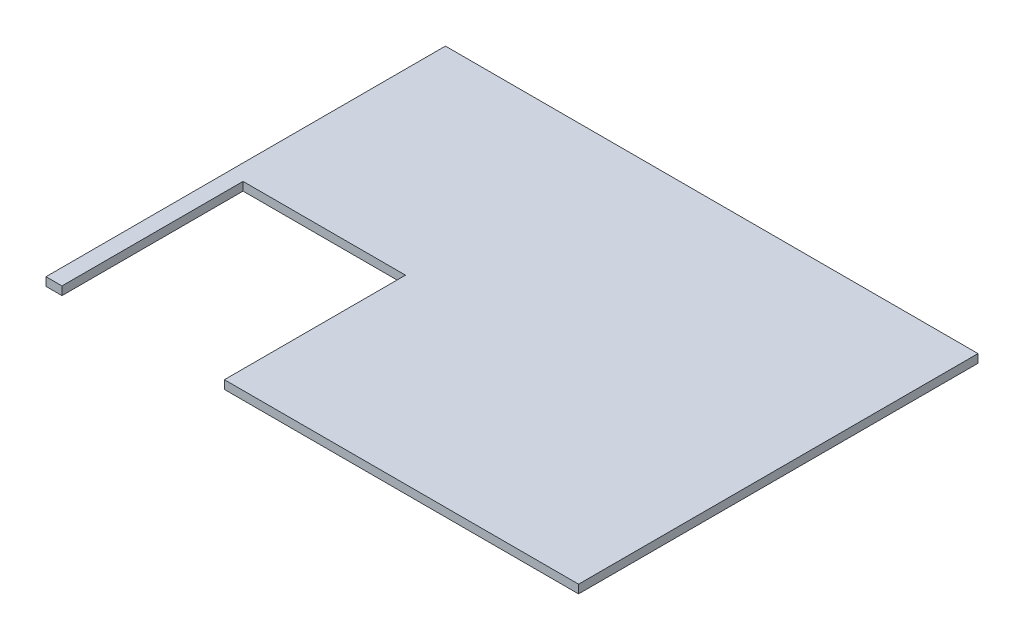
ISO-10303-21;
HEADER;
FILE_DESCRIPTION(('STEP AP214'),'2;1');
FILE_NAME('part.step','',(''),(''),'','','');
FILE_SCHEMA(('AUTOMOTIVE_DESIGN { 1 0 10303 214 1 1 1 1 }'));
ENDSEC;
DATA;
#1=APPLICATION_CONTEXT('core data for automotive mechanical design processes');
#2=APPLICATION_PROTOCOL_DEFINITION('international standard','automotive_design',2000,#1);
#3=PRODUCT_CONTEXT('',#1,'mechanical');
#4=PRODUCT('Part','Part','',(#3));
#5=PRODUCT_RELATED_PRODUCT_CATEGORY('part','',(#4));
#6=PRODUCT_DEFINITION_FORMATION('','',#4);
#7=PRODUCT_DEFINITION_CONTEXT('part definition',#1,'design');
#8=PRODUCT_DEFINITION('design','',#6,#7);
#9=PRODUCT_DEFINITION_SHAPE('','',#8);
#10=(LENGTH_UNIT() NAMED_UNIT(*) SI_UNIT(.MILLI.,.METRE.));
#11=(NAMED_UNIT(*) PLANE_ANGLE_UNIT() SI_UNIT($,.RADIAN.));
#12=(NAMED_UNIT(*) SI_UNIT($,.STERADIAN.) SOLID_ANGLE_UNIT());
#13=UNCERTAINTY_MEASURE_WITH_UNIT(LENGTH_MEASURE(1.E-05),#10,'distance_accuracy_value','');
#14=(GEOMETRIC_REPRESENTATION_CONTEXT(3) GLOBAL_UNCERTAINTY_ASSIGNED_CONTEXT((#13)) GLOBAL_UNIT_ASSIGNED_CONTEXT((#10,
#11,#12)) REPRESENTATION_CONTEXT('',''));
#15=CARTESIAN_POINT('',(0.,0.,0.));
#16=DIRECTION('',(0.,0.,1.));
#17=DIRECTION('',(1.,0.,0.));
#18=AXIS2_PLACEMENT_3D('',#15,#16,#17);
#19=CARTESIAN_POINT('',(3.,1.5875,0.));
#20=DIRECTION('',(-1.,0.,0.));
#21=DIRECTION('',(0.,0.,1.));
#22=AXIS2_PLACEMENT_3D('',#19,#20,#21);
#23=PLANE('',#22);
#24=DIRECTION('',(0.,0.,-1.));
#25=VECTOR('',#24,1.);
#26=CARTESIAN_POINT('',(3.,0.,0.));
#27=LINE('',#26,#25);
#28=CARTESIAN_POINT('',(3.,0.,0.));
#29=VERTEX_POINT('',#28);
#30=CARTESIAN_POINT('',(3.,0.,-34.));
#31=VERTEX_POINT('',#30);
#32=EDGE_CURVE('E128',#29,#31,#27,.T.);
#33=ORIENTED_EDGE('',*,*,#32,.T.);
#34=DIRECTION('',(0.,-1.,0.));
#35=VECTOR('',#34,1.);
#36=CARTESIAN_POINT('',(3.,1.5875,-34.));
#37=LINE('',#36,#35);
#38=CARTESIAN_POINT('',(3.,1.5875,-34.));
#39=VERTEX_POINT('',#38);
#40=EDGE_CURVE('E11',#39,#31,#37,.T.);
#41=ORIENTED_EDGE('',*,*,#40,.F.);
#42=DIRECTION('',(0.,0.,-1.));
#43=VECTOR('',#42,1.);
#44=CARTESIAN_POINT('',(3.,1.5875,0.));
#45=LINE('',#44,#43);
#46=CARTESIAN_POINT('',(3.,1.5875,0.));
#47=VERTEX_POINT('',#46);
#48=EDGE_CURVE('E142',#47,#39,#45,.T.);
#49=ORIENTED_EDGE('',*,*,#48,.F.);
#50=DIRECTION('',(0.,-1.,0.));
#51=VECTOR('',#50,1.);
#52=CARTESIAN_POINT('',(3.,1.5875,0.));
#53=LINE('',#52,#51);
#54=EDGE_CURVE('E124',#47,#29,#53,.T.);
#55=ORIENTED_EDGE('',*,*,#54,.T.);
#56=EDGE_LOOP('',(#33,#41,#49,#55));
#57=FACE_BOUND('',#56,.T.);
#58=ADVANCED_FACE('F32',(#57),#23,.F.);
#59=CARTESIAN_POINT('',(3.,1.5875,-34.));
#60=DIRECTION('',(0.,0.,-1.));
#61=DIRECTION('',(-1.,0.,0.));
#62=AXIS2_PLACEMENT_3D('',#59,#60,#61);
#63=PLANE('',#62);
#64=DIRECTION('',(1.,0.,0.));
#65=VECTOR('',#64,1.);
#66=CARTESIAN_POINT('',(3.,0.,-34.));
#67=LINE('',#66,#65);
#68=CARTESIAN_POINT('',(33.5,0.,-34.));
#69=VERTEX_POINT('',#68);
#70=EDGE_CURVE('E131',#31,#69,#67,.T.);
#71=ORIENTED_EDGE('',*,*,#70,.T.);
#72=DIRECTION('',(0.,-1.,0.));
#73=VECTOR('',#72,1.);
#74=CARTESIAN_POINT('',(33.5,1.5875,-34.));
#75=LINE('',#74,#73);
#76=CARTESIAN_POINT('',(33.5,1.5875,-34.));
#77=VERTEX_POINT('',#76);
#78=EDGE_CURVE('E40',#77,#69,#75,.T.);
#79=ORIENTED_EDGE('',*,*,#78,.F.);
#80=DIRECTION('',(1.,0.,0.));
#81=VECTOR('',#80,1.);
#82=CARTESIAN_POINT('',(3.,1.5875,-34.));
#83=LINE('',#82,#81);
#84=EDGE_CURVE('E91',#39,#77,#83,.T.);
#85=ORIENTED_EDGE('',*,*,#84,.F.);
#86=ORIENTED_EDGE('',*,*,#40,.T.);
#87=EDGE_LOOP('',(#71,#79,#85,#86));
#88=FACE_BOUND('',#87,.T.);
#89=ADVANCED_FACE('F177',(#88),#63,.F.);
#90=CARTESIAN_POINT('',(33.5,1.5875,-34.));
#91=DIRECTION('',(1.,0.,0.));
#92=DIRECTION('',(0.,0.,-1.));
#93=AXIS2_PLACEMENT_3D('',#90,#91,#92);
#94=PLANE('',#93);
#95=DIRECTION('',(0.,0.,1.));
#96=VECTOR('',#95,1.);
#97=CARTESIAN_POINT('',(33.5,0.,-34.));
#98=LINE('',#97,#96);
#99=CARTESIAN_POINT('',(33.5,0.,0.));
#100=VERTEX_POINT('',#99);
#101=EDGE_CURVE('E133',#69,#100,#98,.T.);
#102=ORIENTED_EDGE('',*,*,#101,.T.);
#103=DIRECTION('',(0.,-1.,0.));
#104=VECTOR('',#103,1.);
#105=CARTESIAN_POINT('',(33.5,1.5875,0.));
#106=LINE('',#105,#104);
#107=CARTESIAN_POINT('',(33.5,1.5875,0.));
#108=VERTEX_POINT('',#107);
#109=EDGE_CURVE('E149',#108,#100,#106,.T.);
#110=ORIENTED_EDGE('',*,*,#109,.F.);
#111=DIRECTION('',(0.,0.,1.));
#112=VECTOR('',#111,1.);
#113=CARTESIAN_POINT('',(33.5,1.5875,-34.));
#114=LINE('',#113,#112);
#115=EDGE_CURVE('E157',#77,#108,#114,.T.);
#116=ORIENTED_EDGE('',*,*,#115,.F.);
#117=ORIENTED_EDGE('',*,*,#78,.T.);
#118=EDGE_LOOP('',(#102,#110,#116,#117));
#119=FACE_BOUND('',#118,.T.);
#120=ADVANCED_FACE('F155',(#119),#94,.F.);
#121=CARTESIAN_POINT('',(33.5,1.5875,0.));
#122=DIRECTION('',(0.,0.,-1.));
#123=DIRECTION('',(-1.,0.,0.));
#124=AXIS2_PLACEMENT_3D('',#121,#122,#123);
#125=PLANE('',#124);
#126=DIRECTION('',(1.,0.,0.));
#127=VECTOR('',#126,1.);
#128=CARTESIAN_POINT('',(33.5,0.,0.));
#129=LINE('',#128,#127);
#130=CARTESIAN_POINT('',(100.,0.,0.));
#131=VERTEX_POINT('',#130);
#132=EDGE_CURVE('E135',#100,#131,#129,.T.);
#133=ORIENTED_EDGE('',*,*,#132,.T.);
#134=DIRECTION('',(0.,-1.,0.));
#135=VECTOR('',#134,1.);
#136=CARTESIAN_POINT('',(100.,1.5875,0.));
#137=LINE('',#136,#135);
#138=CARTESIAN_POINT('',(100.,1.5875,0.));
#139=VERTEX_POINT('',#138);
#140=EDGE_CURVE('E146',#139,#131,#137,.T.);
#141=ORIENTED_EDGE('',*,*,#140,.F.);
#142=DIRECTION('',(1.,0.,0.));
#143=VECTOR('',#142,1.);
#144=CARTESIAN_POINT('',(33.5,1.5875,0.));
#145=LINE('',#144,#143);
#146=EDGE_CURVE('E169',#108,#139,#145,.T.);
#147=ORIENTED_EDGE('',*,*,#146,.F.);
#148=ORIENTED_EDGE('',*,*,#109,.T.);
#149=EDGE_LOOP('',(#133,#141,#147,#148));
#150=FACE_BOUND('',#149,.T.);
#151=ADVANCED_FACE('F165',(#150),#125,.F.);
#152=CARTESIAN_POINT('',(100.,1.5875,0.));
#153=DIRECTION('',(-1.,0.,0.));
#154=DIRECTION('',(0.,0.,1.));
#155=AXIS2_PLACEMENT_3D('',#152,#153,#154);
#156=PLANE('',#155);
#157=DIRECTION('',(0.,0.,-1.));
#158=VECTOR('',#157,1.);
#159=CARTESIAN_POINT('',(100.,0.,0.));
#160=LINE('',#159,#158);
#161=CARTESIAN_POINT('',(100.,0.,-75.));
#162=VERTEX_POINT('',#161);
#163=EDGE_CURVE('E137',#131,#162,#160,.T.);
#164=ORIENTED_EDGE('',*,*,#163,.T.);
#165=DIRECTION('',(0.,-1.,0.));
#166=VECTOR('',#165,1.);
#167=CARTESIAN_POINT('',(100.,1.5875,-75.));
#168=LINE('',#167,#166);
#169=CARTESIAN_POINT('',(100.,1.5875,-75.));
#170=VERTEX_POINT('',#169);
#171=EDGE_CURVE('E119',#170,#162,#168,.T.);
#172=ORIENTED_EDGE('',*,*,#171,.F.);
#173=DIRECTION('',(0.,0.,-1.));
#174=VECTOR('',#173,1.);
#175=CARTESIAN_POINT('',(100.,1.5875,0.));
#176=LINE('',#175,#174);
#177=EDGE_CURVE('E110',#139,#170,#176,.T.);
#178=ORIENTED_EDGE('',*,*,#177,.F.);
#179=ORIENTED_EDGE('',*,*,#140,.T.);
#180=EDGE_LOOP('',(#164,#172,#178,#179));
#181=FACE_BOUND('',#180,.T.);
#182=ADVANCED_FACE('F168',(#181),#156,.F.);
#183=CARTESIAN_POINT('',(100.,1.5875,-75.));
#184=DIRECTION('',(0.,0.,1.));
#185=DIRECTION('',(1.,0.,0.));
#186=AXIS2_PLACEMENT_3D('',#183,#184,#185);
#187=PLANE('',#186);
#188=DIRECTION('',(-1.,0.,0.));
#189=VECTOR('',#188,1.);
#190=CARTESIAN_POINT('',(100.,0.,-75.));
#191=LINE('',#190,#189);
#192=CARTESIAN_POINT('',(0.,0.,-75.));
#193=VERTEX_POINT('',#192);
#194=EDGE_CURVE('E118',#162,#193,#191,.T.);
#195=ORIENTED_EDGE('',*,*,#194,.T.);
#196=DIRECTION('',(0.,-1.,0.));
#197=VECTOR('',#196,1.);
#198=CARTESIAN_POINT('',(0.,1.5875,-75.));
#199=LINE('',#198,#197);
#200=CARTESIAN_POINT('',(0.,1.5875,-75.));
#201=VERTEX_POINT('',#200);
#202=EDGE_CURVE('E115',#201,#193,#199,.T.);
#203=ORIENTED_EDGE('',*,*,#202,.F.);
#204=DIRECTION('',(-1.,0.,0.));
#205=VECTOR('',#204,1.);
#206=CARTESIAN_POINT('',(100.,1.5875,-75.));
#207=LINE('',#206,#205);
#208=EDGE_CURVE('E104',#170,#201,#207,.T.);
#209=ORIENTED_EDGE('',*,*,#208,.F.);
#210=ORIENTED_EDGE('',*,*,#171,.T.);
#211=EDGE_LOOP('',(#195,#203,#209,#210));
#212=FACE_BOUND('',#211,.T.);
#213=ADVANCED_FACE('F116',(#212),#187,.F.);
#214=CARTESIAN_POINT('',(0.,1.5875,-75.));
#215=DIRECTION('',(1.,0.,0.));
#216=DIRECTION('',(0.,0.,-1.));
#217=AXIS2_PLACEMENT_3D('',#214,#215,#216);
#218=PLANE('',#217);
#219=DIRECTION('',(0.,0.,1.));
#220=VECTOR('',#219,1.);
#221=CARTESIAN_POINT('',(0.,0.,-75.));
#222=LINE('',#221,#220);
#223=CARTESIAN_POINT('',(0.,0.,0.));
#224=VERTEX_POINT('',#223);
#225=EDGE_CURVE('E77',#193,#224,#222,.T.);
#226=ORIENTED_EDGE('',*,*,#225,.T.);
#227=DIRECTION('',(0.,-1.,0.));
#228=VECTOR('',#227,1.);
#229=CARTESIAN_POINT('',(0.,1.5875,0.));
#230=LINE('',#229,#228);
#231=CARTESIAN_POINT('',(0.,1.5875,0.));
#232=VERTEX_POINT('',#231);
#233=EDGE_CURVE('E120',#232,#224,#230,.T.);
#234=ORIENTED_EDGE('',*,*,#233,.F.);
#235=DIRECTION('',(0.,0.,1.));
#236=VECTOR('',#235,1.);
#237=CARTESIAN_POINT('',(0.,1.5875,-75.));
#238=LINE('',#237,#236);
#239=EDGE_CURVE('E108',#201,#232,#238,.T.);
#240=ORIENTED_EDGE('',*,*,#239,.F.);
#241=ORIENTED_EDGE('',*,*,#202,.T.);
#242=EDGE_LOOP('',(#226,#234,#240,#241));
#243=FACE_BOUND('',#242,.T.);
#244=ADVANCED_FACE('F122',(#243),#218,.F.);
#245=CARTESIAN_POINT('',(0.,1.5875,0.));
#246=DIRECTION('',(0.,0.,-1.));
#247=DIRECTION('',(-1.,0.,0.));
#248=AXIS2_PLACEMENT_3D('',#245,#246,#247);
#249=PLANE('',#248);
#250=DIRECTION('',(1.,0.,0.));
#251=VECTOR('',#250,1.);
#252=CARTESIAN_POINT('',(0.,0.,0.));
#253=LINE('',#252,#251);
#254=EDGE_CURVE('E83',#224,#29,#253,.T.);
#255=ORIENTED_EDGE('',*,*,#254,.T.);
#256=ORIENTED_EDGE('',*,*,#54,.F.);
#257=DIRECTION('',(1.,0.,0.));
#258=VECTOR('',#257,1.);
#259=CARTESIAN_POINT('',(0.,1.5875,0.));
#260=LINE('',#259,#258);
#261=EDGE_CURVE('E48',#232,#47,#260,.T.);
#262=ORIENTED_EDGE('',*,*,#261,.F.);
#263=ORIENTED_EDGE('',*,*,#233,.T.);
#264=EDGE_LOOP('',(#255,#256,#262,#263));
#265=FACE_BOUND('',#264,.T.);
#266=ADVANCED_FACE('F193',(#265),#249,.F.);
#267=CARTESIAN_POINT('',(3.,1.5875,-34.));
#268=DIRECTION('',(0.,-1.,0.));
#269=DIRECTION('',(0.,0.,-1.));
#270=AXIS2_PLACEMENT_3D('',#267,#268,#269);
#271=PLANE('',#270);
#272=ORIENTED_EDGE('',*,*,#48,.T.);
#273=ORIENTED_EDGE('',*,*,#84,.T.);
#274=ORIENTED_EDGE('',*,*,#115,.T.);
#275=ORIENTED_EDGE('',*,*,#146,.T.);
#276=ORIENTED_EDGE('',*,*,#177,.T.);
#277=ORIENTED_EDGE('',*,*,#208,.T.);
#278=ORIENTED_EDGE('',*,*,#239,.T.);
#279=ORIENTED_EDGE('',*,*,#261,.T.);
#280=EDGE_LOOP('',(#272,#273,#274,#275,#276,#277,#278,#279));
#281=FACE_BOUND('',#280,.T.);
#282=ADVANCED_FACE('F106',(#281),#271,.F.);
#283=CARTESIAN_POINT('',(3.,0.,-34.));
#284=DIRECTION('',(0.,-1.,0.));
#285=DIRECTION('',(0.,0.,-1.));
#286=AXIS2_PLACEMENT_3D('',#283,#284,#285);
#287=PLANE('',#286);
#288=ORIENTED_EDGE('',*,*,#32,.F.);
#289=ORIENTED_EDGE('',*,*,#254,.F.);
#290=ORIENTED_EDGE('',*,*,#225,.F.);
#291=ORIENTED_EDGE('',*,*,#194,.F.);
#292=ORIENTED_EDGE('',*,*,#163,.F.);
#293=ORIENTED_EDGE('',*,*,#132,.F.);
#294=ORIENTED_EDGE('',*,*,#101,.F.);
#295=ORIENTED_EDGE('',*,*,#70,.F.);
#296=EDGE_LOOP('',(#288,#289,#290,#291,#292,#293,#294,#295));
#297=FACE_BOUND('',#296,.T.);
#298=ADVANCED_FACE('F161',(#297),#287,.T.);
#299=CLOSED_SHELL('',(#58,#89,#120,#151,#182,#213,#244,#266,#282,#298));
#300=MANIFOLD_SOLID_BREP('B2',#299);
#301=ADVANCED_BREP_SHAPE_REPRESENTATION('',(#18,#300),#14);
#302=SHAPE_DEFINITION_REPRESENTATION(#9,#301);
ENDSEC;
END-ISO-10303-21;
